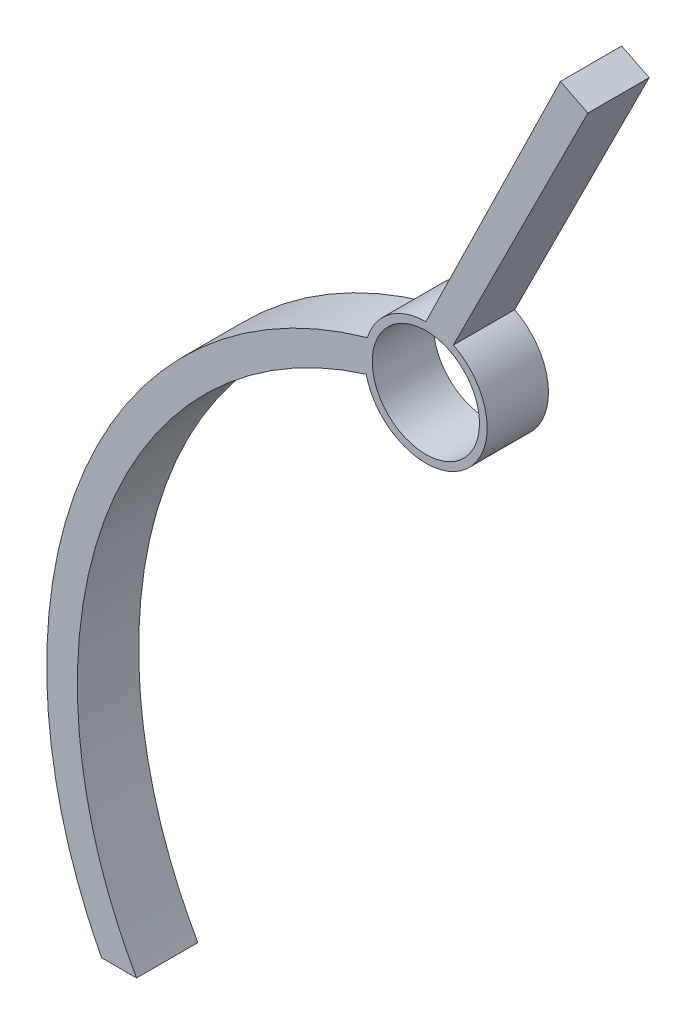
ISO-10303-21;
HEADER;
FILE_DESCRIPTION(('STEP AP214'),'2;1');
FILE_NAME('part.step','',(''),(''),'','','');
FILE_SCHEMA(('AUTOMOTIVE_DESIGN { 1 0 10303 214 1 1 1 1 }'));
ENDSEC;
DATA;
#1=APPLICATION_CONTEXT('core data for automotive mechanical design processes');
#2=APPLICATION_PROTOCOL_DEFINITION('international standard','automotive_design',2000,#1);
#3=PRODUCT_CONTEXT('',#1,'mechanical');
#4=PRODUCT('Part','Part','',(#3));
#5=PRODUCT_RELATED_PRODUCT_CATEGORY('part','',(#4));
#6=PRODUCT_DEFINITION_FORMATION('','',#4);
#7=PRODUCT_DEFINITION_CONTEXT('part definition',#1,'design');
#8=PRODUCT_DEFINITION('design','',#6,#7);
#9=PRODUCT_DEFINITION_SHAPE('','',#8);
#10=(LENGTH_UNIT() NAMED_UNIT(*) SI_UNIT(.MILLI.,.METRE.));
#11=(NAMED_UNIT(*) PLANE_ANGLE_UNIT() SI_UNIT($,.RADIAN.));
#12=(NAMED_UNIT(*) SI_UNIT($,.STERADIAN.) SOLID_ANGLE_UNIT());
#13=UNCERTAINTY_MEASURE_WITH_UNIT(LENGTH_MEASURE(1.E-05),#10,'distance_accuracy_value','');
#14=(GEOMETRIC_REPRESENTATION_CONTEXT(3) GLOBAL_UNCERTAINTY_ASSIGNED_CONTEXT((#13)) GLOBAL_UNIT_ASSIGNED_CONTEXT((#10,
#11,#12)) REPRESENTATION_CONTEXT('',''));
#15=CARTESIAN_POINT('',(0.,0.,0.));
#16=DIRECTION('',(0.,0.,1.));
#17=DIRECTION('',(1.,0.,0.));
#18=AXIS2_PLACEMENT_3D('',#15,#16,#17);
#19=CARTESIAN_POINT('',(0.,0.,40.));
#20=DIRECTION('',(0.,0.,1.));
#21=DIRECTION('',(0.,1.,0.));
#22=AXIS2_PLACEMENT_3D('',#19,#20,#21);
#23=ELLIPSE('',#22,280.,260.);
#24=DIRECTION('',(0.,0.,-1.));
#25=VECTOR('',#24,1.);
#26=SURFACE_OF_LINEAR_EXTRUSION('',#23,#25);
#27=CARTESIAN_POINT('',(0.,0.,0.));
#28=DIRECTION('',(0.,0.,1.));
#29=DIRECTION('',(0.,1.,0.));
#30=AXIS2_PLACEMENT_3D('',#27,#28,#29);
#31=ELLIPSE('',#30,280.,260.);
#32=CARTESIAN_POINT('',(-71.5555209610737,269.18727400657,0.));
#33=VERTEX_POINT('',#32);
#34=CARTESIAN_POINT('',(-221.365281412424,-146.862508423582,0.));
#35=VERTEX_POINT('',#34);
#36=EDGE_CURVE('E149',#33,#35,#31,.T.);
#37=ORIENTED_EDGE('',*,*,#36,.F.);
#38=DIRECTION('',(0.,0.,-1.));
#39=VECTOR('',#38,1.);
#40=CARTESIAN_POINT('',(-71.5555209610737,269.18727400657,40.));
#41=LINE('',#40,#39);
#42=CARTESIAN_POINT('',(-71.5555209610737,269.18727400657,40.));
#43=VERTEX_POINT('',#42);
#44=EDGE_CURVE('E11',#43,#33,#41,.T.);
#45=ORIENTED_EDGE('',*,*,#44,.F.);
#46=CARTESIAN_POINT('',(-221.365281412424,-146.862508423582,40.));
#47=VERTEX_POINT('',#46);
#48=EDGE_CURVE('E191',#43,#47,#23,.T.);
#49=ORIENTED_EDGE('',*,*,#48,.T.);
#50=DIRECTION('',(0.,0.,-1.));
#51=VECTOR('',#50,1.);
#52=CARTESIAN_POINT('',(-221.365281412424,-146.862508423582,40.));
#53=LINE('',#52,#51);
#54=EDGE_CURVE('E83',#47,#35,#53,.T.);
#55=ORIENTED_EDGE('',*,*,#54,.T.);
#56=EDGE_LOOP('',(#37,#45,#49,#55));
#57=FACE_BOUND('',#56,.T.);
#58=ADVANCED_FACE('F32',(#57),#26,.T.);
#59=CARTESIAN_POINT('',(-32.6176270038215,278.343715136932,40.));
#60=DIRECTION('',(0.,0.,-1.));
#61=DIRECTION('',(-1.,0.,0.));
#62=AXIS2_PLACEMENT_3D('',#59,#60,#61);
#63=CYLINDRICAL_SURFACE('',#62,40.);
#64=CARTESIAN_POINT('',(-32.6176270038215,278.343715136932,0.));
#65=DIRECTION('',(0.,0.,1.));
#66=DIRECTION('',(1.,0.,0.));
#67=AXIS2_PLACEMENT_3D('',#64,#65,#66);
#68=CIRCLE('',#67,40.);
#69=CARTESIAN_POINT('',(-14.6863043278763,314.099381360499,0.));
#70=VERTEX_POINT('',#69);
#71=EDGE_CURVE('E147',#33,#70,#68,.T.);
#72=ORIENTED_EDGE('',*,*,#71,.T.);
#73=DIRECTION('',(0.,0.,-1.));
#74=VECTOR('',#73,1.);
#75=CARTESIAN_POINT('',(-14.6863043278763,314.099381360499,40.));
#76=LINE('',#75,#74);
#77=CARTESIAN_POINT('',(-14.6863043278763,314.099381360499,40.));
#78=VERTEX_POINT('',#77);
#79=EDGE_CURVE('E41',#78,#70,#76,.T.);
#80=ORIENTED_EDGE('',*,*,#79,.F.);
#81=CARTESIAN_POINT('',(-32.6176270038215,278.343715136932,40.));
#82=DIRECTION('',(0.,0.,1.));
#83=DIRECTION('',(1.,0.,0.));
#84=AXIS2_PLACEMENT_3D('',#81,#82,#83);
#85=CIRCLE('',#84,40.);
#86=EDGE_CURVE('E195',#43,#78,#85,.T.);
#87=ORIENTED_EDGE('',*,*,#86,.F.);
#88=ORIENTED_EDGE('',*,*,#44,.T.);
#89=EDGE_LOOP('',(#72,#80,#87,#88));
#90=FACE_BOUND('',#89,.T.);
#91=ADVANCED_FACE('F148',(#90),#63,.T.);
#92=CARTESIAN_POINT('',(-137.599780772969,69.0057361468811,40.));
#93=DIRECTION('',(-0.893891655589177,0.448283066898629,0.));
#94=DIRECTION('',(-0.448283066898629,-0.893891655589177,0.));
#95=AXIS2_PLACEMENT_3D('',#92,#93,#94);
#96=PLANE('',#95);
#97=DIRECTION('',(0.448283066898629,0.893891655589177,0.));
#98=VECTOR('',#97,1.);
#99=CARTESIAN_POINT('',(-137.599780772969,69.0057361468811,0.));
#100=LINE('',#99,#98);
#101=CARTESIAN_POINT('',(73.0628499759412,489.074174318554,0.));
#102=VERTEX_POINT('',#101);
#103=EDGE_CURVE('E141',#70,#102,#100,.T.);
#104=ORIENTED_EDGE('',*,*,#103,.T.);
#105=DIRECTION('',(0.,0.,-1.));
#106=VECTOR('',#105,1.);
#107=CARTESIAN_POINT('',(73.0628499759412,489.074174318554,40.));
#108=LINE('',#107,#106);
#109=CARTESIAN_POINT('',(73.0628499759412,489.074174318554,40.));
#110=VERTEX_POINT('',#109);
#111=EDGE_CURVE('E132',#110,#102,#108,.T.);
#112=ORIENTED_EDGE('',*,*,#111,.F.);
#113=DIRECTION('',(0.448283066898629,0.893891655589177,0.));
#114=VECTOR('',#113,1.);
#115=CARTESIAN_POINT('',(-137.599780772969,69.0057361468811,40.));
#116=LINE('',#115,#114);
#117=EDGE_CURVE('E143',#78,#110,#116,.T.);
#118=ORIENTED_EDGE('',*,*,#117,.F.);
#119=ORIENTED_EDGE('',*,*,#79,.T.);
#120=EDGE_LOOP('',(#104,#112,#118,#119));
#121=FACE_BOUND('',#120,.T.);
#122=ADVANCED_FACE('F139',(#121),#96,.F.);
#123=CARTESIAN_POINT('',(210.66263074891,420.068438171674,40.));
#124=DIRECTION('',(-0.448283066898628,-0.893891655589177,0.));
#125=DIRECTION('',(0.893891655589177,-0.448283066898628,0.));
#126=AXIS2_PLACEMENT_3D('',#123,#124,#125);
#127=PLANE('',#126);
#128=DIRECTION('',(-0.893891655589177,0.448283066898628,0.));
#129=VECTOR('',#128,1.);
#130=CARTESIAN_POINT('',(210.66263074891,420.068438171674,0.));
#131=LINE('',#130,#129);
#132=CARTESIAN_POINT('',(55.1850168641577,498.039835656527,0.));
#133=VERTEX_POINT('',#132);
#134=EDGE_CURVE('E151',#102,#133,#131,.T.);
#135=ORIENTED_EDGE('',*,*,#134,.T.);
#136=DIRECTION('',(0.,0.,-1.));
#137=VECTOR('',#136,1.);
#138=CARTESIAN_POINT('',(55.1850168641577,498.039835656527,40.));
#139=LINE('',#138,#137);
#140=CARTESIAN_POINT('',(55.1850168641577,498.039835656527,40.));
#141=VERTEX_POINT('',#140);
#142=EDGE_CURVE('E125',#141,#133,#139,.T.);
#143=ORIENTED_EDGE('',*,*,#142,.F.);
#144=DIRECTION('',(-0.893891655589177,0.448283066898628,0.));
#145=VECTOR('',#144,1.);
#146=CARTESIAN_POINT('',(210.66263074891,420.068438171674,40.));
#147=LINE('',#146,#145);
#148=EDGE_CURVE('E198',#110,#141,#147,.T.);
#149=ORIENTED_EDGE('',*,*,#148,.F.);
#150=ORIENTED_EDGE('',*,*,#111,.T.);
#151=EDGE_LOOP('',(#135,#143,#149,#150));
#152=FACE_BOUND('',#151,.T.);
#153=ADVANCED_FACE('F202',(#152),#127,.F.);
#154=CARTESIAN_POINT('',(-151.900189466707,74.2210694402247,40.));
#155=DIRECTION('',(0.898480602597975,-0.439013219339896,0.));
#156=DIRECTION('',(0.439013219339896,0.898480602597975,0.));
#157=AXIS2_PLACEMENT_3D('',#154,#155,#156);
#158=PLANE('',#157);
#159=DIRECTION('',(-0.439013219339896,-0.898480602597975,0.));
#160=VECTOR('',#159,1.);
#161=CARTESIAN_POINT('',(-151.900189466707,74.2210694402247,0.));
#162=LINE('',#161,#160);
#163=CARTESIAN_POINT('',(-32.6176270038215,318.343715136932,0.));
#164=VERTEX_POINT('',#163);
#165=EDGE_CURVE('E159',#133,#164,#162,.T.);
#166=ORIENTED_EDGE('',*,*,#165,.T.);
#167=DIRECTION('',(0.,0.,-1.));
#168=VECTOR('',#167,1.);
#169=CARTESIAN_POINT('',(-32.6176270038215,318.343715136932,40.));
#170=LINE('',#169,#168);
#171=CARTESIAN_POINT('',(-32.6176270038215,318.343715136932,40.));
#172=VERTEX_POINT('',#171);
#173=EDGE_CURVE('E123',#172,#164,#170,.T.);
#174=ORIENTED_EDGE('',*,*,#173,.F.);
#175=DIRECTION('',(-0.439013219339896,-0.898480602597975,0.));
#176=VECTOR('',#175,1.);
#177=CARTESIAN_POINT('',(-151.900189466707,74.2210694402247,40.));
#178=LINE('',#177,#176);
#179=EDGE_CURVE('E116',#141,#172,#178,.T.);
#180=ORIENTED_EDGE('',*,*,#179,.F.);
#181=ORIENTED_EDGE('',*,*,#142,.T.);
#182=EDGE_LOOP('',(#166,#174,#180,#181));
#183=FACE_BOUND('',#182,.T.);
#184=ADVANCED_FACE('F204',(#183),#158,.F.);
#185=CARTESIAN_POINT('',(-32.6176270038215,278.343715136932,40.));
#186=DIRECTION('',(0.,0.,-1.));
#187=DIRECTION('',(-1.,0.,0.));
#188=AXIS2_PLACEMENT_3D('',#185,#186,#187);
#189=CYLINDRICAL_SURFACE('',#188,40.);
#190=CARTESIAN_POINT('',(-32.6176270038215,278.343715136932,0.));
#191=DIRECTION('',(0.,0.,1.));
#192=DIRECTION('',(1.,0.,0.));
#193=AXIS2_PLACEMENT_3D('',#190,#191,#192);
#194=CIRCLE('',#193,40.);
#195=CARTESIAN_POINT('',(-70.804603560237,290.249798518119,0.));
#196=VERTEX_POINT('',#195);
#197=EDGE_CURVE('E122',#164,#196,#194,.T.);
#198=ORIENTED_EDGE('',*,*,#197,.T.);
#199=DIRECTION('',(0.,0.,-1.));
#200=VECTOR('',#199,1.);
#201=CARTESIAN_POINT('',(-70.804603560237,290.249798518119,40.));
#202=LINE('',#201,#200);
#203=CARTESIAN_POINT('',(-70.804603560237,290.249798518119,40.));
#204=VERTEX_POINT('',#203);
#205=EDGE_CURVE('E108',#204,#196,#202,.T.);
#206=ORIENTED_EDGE('',*,*,#205,.F.);
#207=CARTESIAN_POINT('',(-32.6176270038215,278.343715136932,40.));
#208=DIRECTION('',(0.,0.,1.));
#209=DIRECTION('',(1.,0.,0.));
#210=AXIS2_PLACEMENT_3D('',#207,#208,#209);
#211=CIRCLE('',#210,40.);
#212=EDGE_CURVE('E111',#172,#204,#211,.T.);
#213=ORIENTED_EDGE('',*,*,#212,.F.);
#214=ORIENTED_EDGE('',*,*,#173,.T.);
#215=EDGE_LOOP('',(#198,#206,#213,#214));
#216=FACE_BOUND('',#215,.T.);
#217=ADVANCED_FACE('F121',(#216),#189,.T.);
#218=CARTESIAN_POINT('',(0.,0.,40.));
#219=DIRECTION('',(0.,0.,1.));
#220=DIRECTION('',(0.,-1.,0.));
#221=AXIS2_PLACEMENT_3D('',#218,#219,#220);
#222=ELLIPSE('',#221,300.,280.);
#223=DIRECTION('',(0.,0.,-1.));
#224=VECTOR('',#223,1.);
#225=SURFACE_OF_LINEAR_EXTRUSION('',#222,#224);
#226=CARTESIAN_POINT('',(0.,0.,0.));
#227=DIRECTION('',(0.,0.,1.));
#228=DIRECTION('',(0.,-1.,0.));
#229=AXIS2_PLACEMENT_3D('',#226,#227,#228);
#230=ELLIPSE('',#229,300.,280.);
#231=CARTESIAN_POINT('',(-244.154369286942,-146.862508423582,0.));
#232=VERTEX_POINT('',#231);
#233=EDGE_CURVE('E163',#196,#232,#230,.T.);
#234=ORIENTED_EDGE('',*,*,#233,.T.);
#235=DIRECTION('',(0.,0.,-1.));
#236=VECTOR('',#235,1.);
#237=CARTESIAN_POINT('',(-244.154369286942,-146.862508423582,40.));
#238=LINE('',#237,#236);
#239=CARTESIAN_POINT('',(-244.154369286942,-146.862508423582,40.));
#240=VERTEX_POINT('',#239);
#241=EDGE_CURVE('E110',#240,#232,#238,.T.);
#242=ORIENTED_EDGE('',*,*,#241,.F.);
#243=EDGE_CURVE('E103',#204,#240,#222,.T.);
#244=ORIENTED_EDGE('',*,*,#243,.F.);
#245=ORIENTED_EDGE('',*,*,#205,.T.);
#246=EDGE_LOOP('',(#234,#242,#244,#245));
#247=FACE_BOUND('',#246,.T.);
#248=ADVANCED_FACE('F106',(#247),#225,.F.);
#249=CARTESIAN_POINT('',(-32.6176270038215,278.343715136932,40.));
#250=DIRECTION('',(0.,0.,-1.));
#251=DIRECTION('',(-1.,0.,0.));
#252=AXIS2_PLACEMENT_3D('',#249,#250,#251);
#253=CYLINDRICAL_SURFACE('',#252,35.);
#254=CARTESIAN_POINT('',(-32.6176270038215,278.343715136932,40.));
#255=DIRECTION('',(0.,0.,1.));
#256=DIRECTION('',(1.,0.,0.));
#257=AXIS2_PLACEMENT_3D('',#254,#255,#256);
#258=CIRCLE('',#257,35.);
#259=CARTESIAN_POINT('',(2.38237299617856,278.343715136932,40.));
#260=VERTEX_POINT('',#259);
#261=EDGE_CURVE('E165',#260,#260,#258,.T.);
#262=ORIENTED_EDGE('',*,*,#261,.T.);
#263=EDGE_LOOP('',(#262));
#264=FACE_BOUND('',#263,.T.);
#265=CARTESIAN_POINT('',(-32.6176270038215,278.343715136932,0.));
#266=DIRECTION('',(0.,0.,1.));
#267=DIRECTION('',(1.,0.,0.));
#268=AXIS2_PLACEMENT_3D('',#265,#266,#267);
#269=CIRCLE('',#268,35.);
#270=CARTESIAN_POINT('',(2.38237299617856,278.343715136932,0.));
#271=VERTEX_POINT('',#270);
#272=EDGE_CURVE('E153',#271,#271,#269,.T.);
#273=ORIENTED_EDGE('',*,*,#272,.F.);
#274=EDGE_LOOP('',(#273));
#275=FACE_BOUND('',#274,.T.);
#276=ADVANCED_FACE('F34',(#264,#275),#253,.F.);
#277=CARTESIAN_POINT('',(0.,-146.862508423582,40.));
#278=DIRECTION('',(0.,1.,0.));
#279=DIRECTION('',(0.,0.,1.));
#280=AXIS2_PLACEMENT_3D('',#277,#278,#279);
#281=PLANE('',#280);
#282=DIRECTION('',(1.,0.,0.));
#283=VECTOR('',#282,1.);
#284=CARTESIAN_POINT('',(0.,-146.862508423582,0.));
#285=LINE('',#284,#283);
#286=EDGE_CURVE('E76',#232,#35,#285,.T.);
#287=ORIENTED_EDGE('',*,*,#286,.T.);
#288=ORIENTED_EDGE('',*,*,#54,.F.);
#289=DIRECTION('',(1.,0.,0.));
#290=VECTOR('',#289,1.);
#291=CARTESIAN_POINT('',(0.,-146.862508423582,40.));
#292=LINE('',#291,#290);
#293=EDGE_CURVE('E49',#240,#47,#292,.T.);
#294=ORIENTED_EDGE('',*,*,#293,.F.);
#295=ORIENTED_EDGE('',*,*,#241,.T.);
#296=EDGE_LOOP('',(#287,#288,#294,#295));
#297=FACE_BOUND('',#296,.T.);
#298=ADVANCED_FACE('F174',(#297),#281,.F.);
#299=CARTESIAN_POINT('',(0.,0.,40.));
#300=DIRECTION('',(0.,0.,1.));
#301=DIRECTION('',(1.,0.,0.));
#302=AXIS2_PLACEMENT_3D('',#299,#300,#301);
#303=PLANE('',#302);
#304=ORIENTED_EDGE('',*,*,#261,.F.);
#305=EDGE_LOOP('',(#304));
#306=FACE_BOUND('',#305,.T.);
#307=ORIENTED_EDGE('',*,*,#48,.F.);
#308=ORIENTED_EDGE('',*,*,#86,.T.);
#309=ORIENTED_EDGE('',*,*,#117,.T.);
#310=ORIENTED_EDGE('',*,*,#148,.T.);
#311=ORIENTED_EDGE('',*,*,#179,.T.);
#312=ORIENTED_EDGE('',*,*,#212,.T.);
#313=ORIENTED_EDGE('',*,*,#243,.T.);
#314=ORIENTED_EDGE('',*,*,#293,.T.);
#315=EDGE_LOOP('',(#307,#308,#309,#310,#311,#312,#313,#314));
#316=FACE_BOUND('',#315,.T.);
#317=ADVANCED_FACE('F114',(#306,#316),#303,.T.);
#318=CARTESIAN_POINT('',(0.,0.,0.));
#319=DIRECTION('',(0.,0.,1.));
#320=DIRECTION('',(1.,0.,0.));
#321=AXIS2_PLACEMENT_3D('',#318,#319,#320);
#322=PLANE('',#321);
#323=ORIENTED_EDGE('',*,*,#272,.T.);
#324=EDGE_LOOP('',(#323));
#325=FACE_BOUND('',#324,.T.);
#326=ORIENTED_EDGE('',*,*,#36,.T.);
#327=ORIENTED_EDGE('',*,*,#286,.F.);
#328=ORIENTED_EDGE('',*,*,#233,.F.);
#329=ORIENTED_EDGE('',*,*,#197,.F.);
#330=ORIENTED_EDGE('',*,*,#165,.F.);
#331=ORIENTED_EDGE('',*,*,#134,.F.);
#332=ORIENTED_EDGE('',*,*,#103,.F.);
#333=ORIENTED_EDGE('',*,*,#71,.F.);
#334=EDGE_LOOP('',(#326,#327,#328,#329,#330,#331,#332,#333));
#335=FACE_BOUND('',#334,.T.);
#336=ADVANCED_FACE('F171',(#325,#335),#322,.F.);
#337=CLOSED_SHELL('',(#58,#91,#122,#153,#184,#217,#248,#276,#298,#317,#336));
#338=MANIFOLD_SOLID_BREP('B2',#337);
#339=ADVANCED_BREP_SHAPE_REPRESENTATION('',(#18,#338),#14);
#340=SHAPE_DEFINITION_REPRESENTATION(#9,#339);
ENDSEC;
END-ISO-10303-21;
